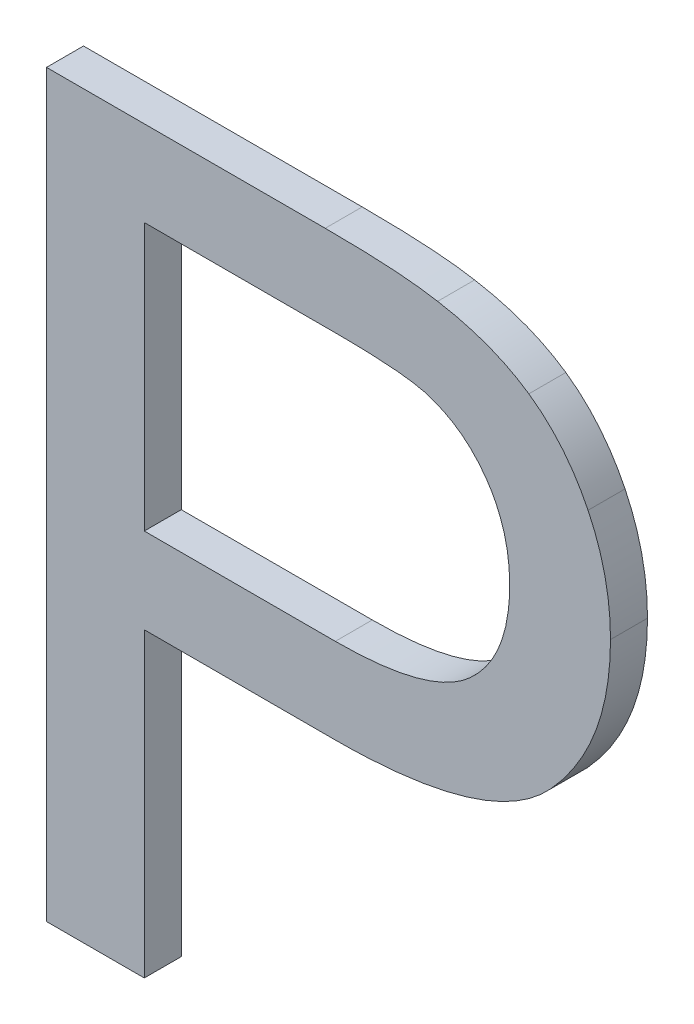
ISO-10303-21;
HEADER;
FILE_DESCRIPTION(('STEP AP214'),'2;1');
FILE_NAME('part.step','',(''),(''),'','','');
FILE_SCHEMA(('AUTOMOTIVE_DESIGN { 1 0 10303 214 1 1 1 1 }'));
ENDSEC;
DATA;
#1=APPLICATION_CONTEXT('core data for automotive mechanical design processes');
#2=APPLICATION_PROTOCOL_DEFINITION('international standard','automotive_design',2000,#1);
#3=PRODUCT_CONTEXT('',#1,'mechanical');
#4=PRODUCT('Part','Part','',(#3));
#5=PRODUCT_RELATED_PRODUCT_CATEGORY('part','',(#4));
#6=PRODUCT_DEFINITION_FORMATION('','',#4);
#7=PRODUCT_DEFINITION_CONTEXT('part definition',#1,'design');
#8=PRODUCT_DEFINITION('design','',#6,#7);
#9=PRODUCT_DEFINITION_SHAPE('','',#8);
#10=(LENGTH_UNIT() NAMED_UNIT(*) SI_UNIT(.MILLI.,.METRE.));
#11=(NAMED_UNIT(*) PLANE_ANGLE_UNIT() SI_UNIT($,.RADIAN.));
#12=(NAMED_UNIT(*) SI_UNIT($,.STERADIAN.) SOLID_ANGLE_UNIT());
#13=UNCERTAINTY_MEASURE_WITH_UNIT(LENGTH_MEASURE(1.E-05),#10,'distance_accuracy_value','');
#14=(GEOMETRIC_REPRESENTATION_CONTEXT(3) GLOBAL_UNCERTAINTY_ASSIGNED_CONTEXT((#13)) GLOBAL_UNIT_ASSIGNED_CONTEXT((#10,
#11,#12)) REPRESENTATION_CONTEXT('',''));
#15=CARTESIAN_POINT('',(0.,0.,0.));
#16=DIRECTION('',(0.,0.,1.));
#17=DIRECTION('',(1.,0.,0.));
#18=AXIS2_PLACEMENT_3D('',#15,#16,#17);
#19=CARTESIAN_POINT('',(2.1538376162,0.609544996919,0.05));
#20=DIRECTION('',(0.,0.,1.));
#21=DIRECTION('',(1.,0.,0.));
#22=AXIS2_PLACEMENT_3D('',#19,#20,#21);
#23=PLANE('',#22);
#24=DIRECTION('',(1.,0.,0.));
#25=VECTOR('',#24,1.);
#26=CARTESIAN_POINT('',(1.989916424419,0.523255813953,0.05));
#27=LINE('',#26,#25);
#28=CARTESIAN_POINT('',(1.989916424419,0.523255813953,0.05));
#29=VERTEX_POINT('',#28);
#30=CARTESIAN_POINT('',(2.248137718023,0.523255813953,0.05));
#31=VERTEX_POINT('',#30);
#32=EDGE_CURVE('E202',#29,#31,#27,.T.);
#33=ORIENTED_EDGE('',*,*,#32,.F.);
#34=DIRECTION('',(0.,-1.,0.));
#35=VECTOR('',#34,1.);
#36=CARTESIAN_POINT('',(1.989916424419,0.884447674419,0.05));
#37=LINE('',#36,#35);
#38=CARTESIAN_POINT('',(1.989916424419,0.884447674419,0.05));
#39=VERTEX_POINT('',#38);
#40=EDGE_CURVE('E383',#39,#29,#37,.T.);
#41=ORIENTED_EDGE('',*,*,#40,.F.);
#42=DIRECTION('',(-1.,0.,0.));
#43=VECTOR('',#42,1.);
#44=CARTESIAN_POINT('',(2.245412427326,0.884447674419,0.05));
#45=LINE('',#44,#43);
#46=CARTESIAN_POINT('',(2.245412427326,0.884447674419,0.05));
#47=VERTEX_POINT('',#46);
#48=EDGE_CURVE('E374',#47,#39,#45,.T.);
#49=ORIENTED_EDGE('',*,*,#48,.F.);
#50=CARTESIAN_POINT('',(2.368731831395,0.875499636628,0.05));
#51=CARTESIAN_POINT('',(2.335347020349,0.884447674419,0.05));
#52=CARTESIAN_POINT('',(2.245412427326,0.884447674419,0.05));
#53=(BOUNDED_CURVE() B_SPLINE_CURVE(2,(#50,#51,#52),.UNSPECIFIED.,.F.,
.F.) B_SPLINE_CURVE_WITH_KNOTS((3,3),(0.,1.),
.UNSPECIFIED.) CURVE() GEOMETRIC_REPRESENTATION_ITEM() RATIONAL_B_SPLINE_CURVE((1.,1.,1.)) REPRESENTATION_ITEM(''));
#54=CARTESIAN_POINT('',(2.368731831395,0.875499636628,0.05));
#55=VERTEX_POINT('',#54);
#56=EDGE_CURVE('E271',#55,#47,#53,.T.);
#57=ORIENTED_EDGE('',*,*,#56,.F.);
#58=CARTESIAN_POINT('',(2.452171148256,0.81586119186,0.05));
#59=CARTESIAN_POINT('',(2.420512354651,0.861010174419,0.05));
#60=CARTESIAN_POINT('',(2.368731831395,0.875499636628,0.05));
#61=(BOUNDED_CURVE() B_SPLINE_CURVE(2,(#58,#59,#60),.UNSPECIFIED.,.F.,
.F.) B_SPLINE_CURVE_WITH_KNOTS((3,3),(0.,1.),
.UNSPECIFIED.) CURVE() GEOMETRIC_REPRESENTATION_ITEM() RATIONAL_B_SPLINE_CURVE((1.,1.,1.)) REPRESENTATION_ITEM(''));
#62=CARTESIAN_POINT('',(2.452171148256,0.81586119186,0.05));
#63=VERTEX_POINT('',#62);
#64=EDGE_CURVE('E125',#63,#55,#61,.T.);
#65=ORIENTED_EDGE('',*,*,#64,.F.);
#66=CARTESIAN_POINT('',(2.483875363372,0.70730377907,0.05));
#67=CARTESIAN_POINT('',(2.483875363372,0.770712209302,0.05));
#68=CARTESIAN_POINT('',(2.452171148256,0.81586119186,0.05));
#69=(BOUNDED_CURVE() B_SPLINE_CURVE(2,(#66,#67,#68),.UNSPECIFIED.,.F.,
.F.) B_SPLINE_CURVE_WITH_KNOTS((3,3),(0.,1.),
.UNSPECIFIED.) CURVE() GEOMETRIC_REPRESENTATION_ITEM() RATIONAL_B_SPLINE_CURVE((1.,1.,1.)) REPRESENTATION_ITEM(''));
#70=CARTESIAN_POINT('',(2.483875363372,0.70730377907,0.05));
#71=VERTEX_POINT('',#70);
#72=EDGE_CURVE('E303',#71,#63,#69,.T.);
#73=ORIENTED_EDGE('',*,*,#72,.F.);
#74=CARTESIAN_POINT('',(2.430050872093,0.571493459302,0.05));
#75=CARTESIAN_POINT('',(2.483875363372,0.619776526163,0.05));
#76=CARTESIAN_POINT('',(2.483875363372,0.70730377907,0.05));
#77=(BOUNDED_CURVE() B_SPLINE_CURVE(2,(#74,#75,#76),.UNSPECIFIED.,.F.,
.F.) B_SPLINE_CURVE_WITH_KNOTS((3,3),(0.,1.),
.UNSPECIFIED.) CURVE() GEOMETRIC_REPRESENTATION_ITEM() RATIONAL_B_SPLINE_CURVE((1.,1.,1.)) REPRESENTATION_ITEM(''));
#78=CARTESIAN_POINT('',(2.430050872093,0.571493459302,0.05));
#79=VERTEX_POINT('',#78);
#80=EDGE_CURVE('E205',#79,#71,#77,.T.);
#81=ORIENTED_EDGE('',*,*,#80,.F.);
#82=CARTESIAN_POINT('',(2.248137718023,0.523255813953,0.05));
#83=CARTESIAN_POINT('',(2.376226380814,0.523255813953,0.05));
#84=CARTESIAN_POINT('',(2.430050872093,0.571493459302,0.05));
#85=(BOUNDED_CURVE() B_SPLINE_CURVE(2,(#82,#83,#84),.UNSPECIFIED.,.F.,
.F.) B_SPLINE_CURVE_WITH_KNOTS((3,3),(0.,1.),
.UNSPECIFIED.) CURVE() GEOMETRIC_REPRESENTATION_ITEM() RATIONAL_B_SPLINE_CURVE((1.,1.,1.)) REPRESENTATION_ITEM(''));
#86=EDGE_CURVE('E28',#31,#79,#85,.T.);
#87=ORIENTED_EDGE('',*,*,#86,.F.);
#88=EDGE_LOOP('',(#33,#41,#49,#57,#65,#73,#81,#87));
#89=FACE_BOUND('',#88,.T.);
#90=DIRECTION('',(0.,1.,0.));
#91=VECTOR('',#90,1.);
#92=CARTESIAN_POINT('',(1.857739825581,0.,0.05));
#93=LINE('',#92,#91);
#94=CARTESIAN_POINT('',(1.857739825581,0.,0.05));
#95=VERTEX_POINT('',#94);
#96=CARTESIAN_POINT('',(1.857739825581,1.,0.05));
#97=VERTEX_POINT('',#96);
#98=EDGE_CURVE('E287',#95,#97,#93,.T.);
#99=ORIENTED_EDGE('',*,*,#98,.F.);
#100=DIRECTION('',(-1.,0.,0.));
#101=VECTOR('',#100,1.);
#102=CARTESIAN_POINT('',(1.989916424419,0.,0.05));
#103=LINE('',#102,#101);
#104=CARTESIAN_POINT('',(1.989916424419,0.,0.05));
#105=VERTEX_POINT('',#104);
#106=EDGE_CURVE('E266',#105,#95,#103,.T.);
#107=ORIENTED_EDGE('',*,*,#106,.F.);
#108=DIRECTION('',(0.,-1.,0.));
#109=VECTOR('',#108,1.);
#110=CARTESIAN_POINT('',(1.989916424419,0.407703488372,0.05));
#111=LINE('',#110,#109);
#112=CARTESIAN_POINT('',(1.989916424419,0.407703488372,0.05));
#113=VERTEX_POINT('',#112);
#114=EDGE_CURVE('E254',#113,#105,#111,.T.);
#115=ORIENTED_EDGE('',*,*,#114,.F.);
#116=DIRECTION('',(-1.,0.,0.));
#117=VECTOR('',#116,1.);
#118=CARTESIAN_POINT('',(2.24609375,0.407703488372,0.05));
#119=LINE('',#118,#117);
#120=CARTESIAN_POINT('',(2.24609375,0.407703488372,0.05));
#121=VERTEX_POINT('',#120);
#122=EDGE_CURVE('E237',#121,#113,#119,.T.);
#123=ORIENTED_EDGE('',*,*,#122,.F.);
#124=CARTESIAN_POINT('',(2.5390625,0.495866642442,0.05));
#125=CARTESIAN_POINT('',(2.457985101744,0.407703488372,0.05));
#126=CARTESIAN_POINT('',(2.24609375,0.407703488372,0.05));
#127=(BOUNDED_CURVE() B_SPLINE_CURVE(2,(#124,#125,#126),.UNSPECIFIED.,.F.,
.F.) B_SPLINE_CURVE_WITH_KNOTS((3,3),(0.,1.),
.UNSPECIFIED.) CURVE() GEOMETRIC_REPRESENTATION_ITEM() RATIONAL_B_SPLINE_CURVE((1.,1.,1.)) REPRESENTATION_ITEM(''));
#128=CARTESIAN_POINT('',(2.5390625,0.495866642442,0.05));
#129=VERTEX_POINT('',#128);
#130=EDGE_CURVE('E379',#129,#121,#127,.T.);
#131=ORIENTED_EDGE('',*,*,#130,.F.);
#132=CARTESIAN_POINT('',(2.620139898256,0.711346293605,0.05));
#133=CARTESIAN_POINT('',(2.620139898256,0.584029796512,0.05));
#134=CARTESIAN_POINT('',(2.5390625,0.495866642442,0.05));
#135=(BOUNDED_CURVE() B_SPLINE_CURVE(2,(#132,#133,#134),.UNSPECIFIED.,.F.,
.F.) B_SPLINE_CURVE_WITH_KNOTS((3,3),(0.,1.),
.UNSPECIFIED.) CURVE() GEOMETRIC_REPRESENTATION_ITEM() RATIONAL_B_SPLINE_CURVE((1.,1.,1.)) REPRESENTATION_ITEM(''));
#136=CARTESIAN_POINT('',(2.620139898256,0.711346293605,0.05));
#137=VERTEX_POINT('',#136);
#138=EDGE_CURVE('E460',#137,#129,#135,.T.);
#139=ORIENTED_EDGE('',*,*,#138,.F.);
#140=CARTESIAN_POINT('',(2.589798328488,0.847519985465,0.05));
#141=CARTESIAN_POINT('',(2.620139898256,0.785565043605,0.05));
#142=CARTESIAN_POINT('',(2.620139898256,0.711346293605,0.05));
#143=(BOUNDED_CURVE() B_SPLINE_CURVE(2,(#140,#141,#142),.UNSPECIFIED.,.F.,
.F.) B_SPLINE_CURVE_WITH_KNOTS((3,3),(0.,1.),
.UNSPECIFIED.) CURVE() GEOMETRIC_REPRESENTATION_ITEM() RATIONAL_B_SPLINE_CURVE((1.,1.,1.)) REPRESENTATION_ITEM(''));
#144=CARTESIAN_POINT('',(2.589798328488,0.847519985465,0.05));
#145=VERTEX_POINT('',#144);
#146=EDGE_CURVE('E345',#145,#137,#143,.T.);
#147=ORIENTED_EDGE('',*,*,#146,.F.);
#148=CARTESIAN_POINT('',(2.509765625,0.943813590116,0.05));
#149=CARTESIAN_POINT('',(2.559502180233,0.909474927326,0.05));
#150=CARTESIAN_POINT('',(2.589798328488,0.847519985465,0.05));
#151=(BOUNDED_CURVE() B_SPLINE_CURVE(2,(#148,#149,#150),.UNSPECIFIED.,.F.,
.F.) B_SPLINE_CURVE_WITH_KNOTS((3,3),(0.,1.),
.UNSPECIFIED.) CURVE() GEOMETRIC_REPRESENTATION_ITEM() RATIONAL_B_SPLINE_CURVE((1.,1.,1.)) REPRESENTATION_ITEM(''));
#152=CARTESIAN_POINT('',(2.509765625,0.943813590116,0.05));
#153=VERTEX_POINT('',#152);
#154=EDGE_CURVE('E292',#153,#145,#151,.T.);
#155=ORIENTED_EDGE('',*,*,#154,.F.);
#156=CARTESIAN_POINT('',(2.38644622093,0.990461482558,0.05));
#157=CARTESIAN_POINT('',(2.460029069767,0.978197674419,0.05));
#158=CARTESIAN_POINT('',(2.509765625,0.943813590116,0.05));
#159=(BOUNDED_CURVE() B_SPLINE_CURVE(2,(#156,#157,#158),.UNSPECIFIED.,.F.,
.F.) B_SPLINE_CURVE_WITH_KNOTS((3,3),(0.,1.),
.UNSPECIFIED.) CURVE() GEOMETRIC_REPRESENTATION_ITEM() RATIONAL_B_SPLINE_CURVE((1.,1.,1.)) REPRESENTATION_ITEM(''));
#160=CARTESIAN_POINT('',(2.38644622093,0.990461482558,0.05));
#161=VERTEX_POINT('',#160);
#162=EDGE_CURVE('E244',#161,#153,#159,.T.);
#163=ORIENTED_EDGE('',*,*,#162,.F.);
#164=CARTESIAN_POINT('',(2.234511264535,1.,0.05));
#165=CARTESIAN_POINT('',(2.333984375,1.,0.05));
#166=CARTESIAN_POINT('',(2.38644622093,0.990461482558,0.05));
#167=(BOUNDED_CURVE() B_SPLINE_CURVE(2,(#164,#165,#166),.UNSPECIFIED.,.F.,
.F.) B_SPLINE_CURVE_WITH_KNOTS((3,3),(0.,1.),
.UNSPECIFIED.) CURVE() GEOMETRIC_REPRESENTATION_ITEM() RATIONAL_B_SPLINE_CURVE((1.,1.,1.)) REPRESENTATION_ITEM(''));
#168=CARTESIAN_POINT('',(2.234511264535,1.,0.05));
#169=VERTEX_POINT('',#168);
#170=EDGE_CURVE('E317',#169,#161,#167,.T.);
#171=ORIENTED_EDGE('',*,*,#170,.F.);
#172=DIRECTION('',(1.,0.,0.));
#173=VECTOR('',#172,1.);
#174=CARTESIAN_POINT('',(1.857739825581,1.,0.05));
#175=LINE('',#174,#173);
#176=EDGE_CURVE('E265',#97,#169,#175,.T.);
#177=ORIENTED_EDGE('',*,*,#176,.F.);
#178=EDGE_LOOP('',(#99,#107,#115,#123,#131,#139,#147,#155,#163,#171,#177));
#179=FACE_BOUND('',#178,.T.);
#180=ADVANCED_FACE('F17',(#89,#179),#23,.T.);
#181=CARTESIAN_POINT('',(2.1538376162,0.609544996919,0.));
#182=DIRECTION('',(0.,0.,1.));
#183=DIRECTION('',(1.,0.,0.));
#184=AXIS2_PLACEMENT_3D('',#181,#182,#183);
#185=PLANE('',#184);
#186=CARTESIAN_POINT('',(2.248137718023,0.523255813953,0.));
#187=CARTESIAN_POINT('',(2.376226380814,0.523255813953,0.));
#188=CARTESIAN_POINT('',(2.430050872093,0.571493459302,0.));
#189=(BOUNDED_CURVE() B_SPLINE_CURVE(2,(#186,#187,#188),.UNSPECIFIED.,.F.,
.F.) B_SPLINE_CURVE_WITH_KNOTS((3,3),(0.,1.),
.UNSPECIFIED.) CURVE() GEOMETRIC_REPRESENTATION_ITEM() RATIONAL_B_SPLINE_CURVE((1.,1.,1.)) REPRESENTATION_ITEM(''));
#190=CARTESIAN_POINT('',(2.248137718023,0.523255813953,0.));
#191=VERTEX_POINT('',#190);
#192=CARTESIAN_POINT('',(2.430050872093,0.571493459302,0.));
#193=VERTEX_POINT('',#192);
#194=EDGE_CURVE('E11',#191,#193,#189,.T.);
#195=ORIENTED_EDGE('',*,*,#194,.T.);
#196=CARTESIAN_POINT('',(2.430050872093,0.571493459302,0.));
#197=CARTESIAN_POINT('',(2.483875363372,0.619776526163,0.));
#198=CARTESIAN_POINT('',(2.483875363372,0.70730377907,0.));
#199=(BOUNDED_CURVE() B_SPLINE_CURVE(2,(#196,#197,#198),.UNSPECIFIED.,.F.,
.F.) B_SPLINE_CURVE_WITH_KNOTS((3,3),(0.,1.),
.UNSPECIFIED.) CURVE() GEOMETRIC_REPRESENTATION_ITEM() RATIONAL_B_SPLINE_CURVE((1.,1.,1.)) REPRESENTATION_ITEM(''));
#200=CARTESIAN_POINT('',(2.483875363372,0.70730377907,0.));
#201=VERTEX_POINT('',#200);
#202=EDGE_CURVE('E208',#193,#201,#199,.T.);
#203=ORIENTED_EDGE('',*,*,#202,.T.);
#204=CARTESIAN_POINT('',(2.483875363372,0.70730377907,0.));
#205=CARTESIAN_POINT('',(2.483875363372,0.770712209302,0.));
#206=CARTESIAN_POINT('',(2.452171148256,0.81586119186,0.));
#207=(BOUNDED_CURVE() B_SPLINE_CURVE(2,(#204,#205,#206),.UNSPECIFIED.,.F.,
.F.) B_SPLINE_CURVE_WITH_KNOTS((3,3),(0.,1.),
.UNSPECIFIED.) CURVE() GEOMETRIC_REPRESENTATION_ITEM() RATIONAL_B_SPLINE_CURVE((1.,1.,1.)) REPRESENTATION_ITEM(''));
#208=CARTESIAN_POINT('',(2.452171148256,0.81586119186,0.));
#209=VERTEX_POINT('',#208);
#210=EDGE_CURVE('E110',#201,#209,#207,.T.);
#211=ORIENTED_EDGE('',*,*,#210,.T.);
#212=CARTESIAN_POINT('',(2.452171148256,0.81586119186,0.));
#213=CARTESIAN_POINT('',(2.420512354651,0.861010174419,0.));
#214=CARTESIAN_POINT('',(2.368731831395,0.875499636628,0.));
#215=(BOUNDED_CURVE() B_SPLINE_CURVE(2,(#212,#213,#214),.UNSPECIFIED.,.F.,
.F.) B_SPLINE_CURVE_WITH_KNOTS((3,3),(0.,1.),
.UNSPECIFIED.) CURVE() GEOMETRIC_REPRESENTATION_ITEM() RATIONAL_B_SPLINE_CURVE((1.,1.,1.)) REPRESENTATION_ITEM(''));
#216=CARTESIAN_POINT('',(2.368731831395,0.875499636628,0.));
#217=VERTEX_POINT('',#216);
#218=EDGE_CURVE('E238',#209,#217,#215,.T.);
#219=ORIENTED_EDGE('',*,*,#218,.T.);
#220=CARTESIAN_POINT('',(2.368731831395,0.875499636628,0.));
#221=CARTESIAN_POINT('',(2.335347020349,0.884447674419,0.));
#222=CARTESIAN_POINT('',(2.245412427326,0.884447674419,0.));
#223=(BOUNDED_CURVE() B_SPLINE_CURVE(2,(#220,#221,#222),.UNSPECIFIED.,.F.,
.F.) B_SPLINE_CURVE_WITH_KNOTS((3,3),(0.,1.),
.UNSPECIFIED.) CURVE() GEOMETRIC_REPRESENTATION_ITEM() RATIONAL_B_SPLINE_CURVE((1.,1.,1.)) REPRESENTATION_ITEM(''));
#224=CARTESIAN_POINT('',(2.245412427326,0.884447674419,0.));
#225=VERTEX_POINT('',#224);
#226=EDGE_CURVE('E277',#217,#225,#223,.T.);
#227=ORIENTED_EDGE('',*,*,#226,.T.);
#228=DIRECTION('',(-1.,0.,0.));
#229=VECTOR('',#228,1.);
#230=CARTESIAN_POINT('',(2.245412427326,0.884447674419,0.));
#231=LINE('',#230,#229);
#232=CARTESIAN_POINT('',(1.989916424419,0.884447674419,0.));
#233=VERTEX_POINT('',#232);
#234=EDGE_CURVE('E431',#225,#233,#231,.T.);
#235=ORIENTED_EDGE('',*,*,#234,.T.);
#236=DIRECTION('',(0.,-1.,0.));
#237=VECTOR('',#236,1.);
#238=CARTESIAN_POINT('',(1.989916424419,0.884447674419,0.));
#239=LINE('',#238,#237);
#240=CARTESIAN_POINT('',(1.989916424419,0.523255813953,0.));
#241=VERTEX_POINT('',#240);
#242=EDGE_CURVE('E375',#233,#241,#239,.T.);
#243=ORIENTED_EDGE('',*,*,#242,.T.);
#244=DIRECTION('',(1.,0.,0.));
#245=VECTOR('',#244,1.);
#246=CARTESIAN_POINT('',(1.989916424419,0.523255813953,0.));
#247=LINE('',#246,#245);
#248=EDGE_CURVE('E215',#241,#191,#247,.T.);
#249=ORIENTED_EDGE('',*,*,#248,.T.);
#250=EDGE_LOOP('',(#195,#203,#211,#219,#227,#235,#243,#249));
#251=FACE_BOUND('',#250,.T.);
#252=DIRECTION('',(1.,0.,0.));
#253=VECTOR('',#252,1.);
#254=CARTESIAN_POINT('',(1.857739825581,1.,0.));
#255=LINE('',#254,#253);
#256=CARTESIAN_POINT('',(1.857739825581,1.,0.));
#257=VERTEX_POINT('',#256);
#258=CARTESIAN_POINT('',(2.234511264535,1.,0.));
#259=VERTEX_POINT('',#258);
#260=EDGE_CURVE('E226',#257,#259,#255,.T.);
#261=ORIENTED_EDGE('',*,*,#260,.T.);
#262=CARTESIAN_POINT('',(2.234511264535,1.,0.));
#263=CARTESIAN_POINT('',(2.333984375,1.,0.));
#264=CARTESIAN_POINT('',(2.38644622093,0.990461482558,0.));
#265=(BOUNDED_CURVE() B_SPLINE_CURVE(2,(#262,#263,#264),.UNSPECIFIED.,.F.,
.F.) B_SPLINE_CURVE_WITH_KNOTS((3,3),(0.,1.),
.UNSPECIFIED.) CURVE() GEOMETRIC_REPRESENTATION_ITEM() RATIONAL_B_SPLINE_CURVE((1.,1.,1.)) REPRESENTATION_ITEM(''));
#266=CARTESIAN_POINT('',(2.38644622093,0.990461482558,0.));
#267=VERTEX_POINT('',#266);
#268=EDGE_CURVE('E322',#259,#267,#265,.T.);
#269=ORIENTED_EDGE('',*,*,#268,.T.);
#270=CARTESIAN_POINT('',(2.38644622093,0.990461482558,0.));
#271=CARTESIAN_POINT('',(2.460029069767,0.978197674419,0.));
#272=CARTESIAN_POINT('',(2.509765625,0.943813590116,0.));
#273=(BOUNDED_CURVE() B_SPLINE_CURVE(2,(#270,#271,#272),.UNSPECIFIED.,.F.,
.F.) B_SPLINE_CURVE_WITH_KNOTS((3,3),(0.,1.),
.UNSPECIFIED.) CURVE() GEOMETRIC_REPRESENTATION_ITEM() RATIONAL_B_SPLINE_CURVE((1.,1.,1.)) REPRESENTATION_ITEM(''));
#274=CARTESIAN_POINT('',(2.509765625,0.943813590116,0.));
#275=VERTEX_POINT('',#274);
#276=EDGE_CURVE('E252',#267,#275,#273,.T.);
#277=ORIENTED_EDGE('',*,*,#276,.T.);
#278=CARTESIAN_POINT('',(2.509765625,0.943813590116,0.));
#279=CARTESIAN_POINT('',(2.559502180233,0.909474927326,0.));
#280=CARTESIAN_POINT('',(2.589798328488,0.847519985465,0.));
#281=(BOUNDED_CURVE() B_SPLINE_CURVE(2,(#278,#279,#280),.UNSPECIFIED.,.F.,
.F.) B_SPLINE_CURVE_WITH_KNOTS((3,3),(0.,1.),
.UNSPECIFIED.) CURVE() GEOMETRIC_REPRESENTATION_ITEM() RATIONAL_B_SPLINE_CURVE((1.,1.,1.)) REPRESENTATION_ITEM(''));
#282=CARTESIAN_POINT('',(2.589798328488,0.847519985465,0.));
#283=VERTEX_POINT('',#282);
#284=EDGE_CURVE('E344',#275,#283,#281,.T.);
#285=ORIENTED_EDGE('',*,*,#284,.T.);
#286=CARTESIAN_POINT('',(2.589798328488,0.847519985465,0.));
#287=CARTESIAN_POINT('',(2.620139898256,0.785565043605,0.));
#288=CARTESIAN_POINT('',(2.620139898256,0.711346293605,0.));
#289=(BOUNDED_CURVE() B_SPLINE_CURVE(2,(#286,#287,#288),.UNSPECIFIED.,.F.,
.F.) B_SPLINE_CURVE_WITH_KNOTS((3,3),(0.,1.),
.UNSPECIFIED.) CURVE() GEOMETRIC_REPRESENTATION_ITEM() RATIONAL_B_SPLINE_CURVE((1.,1.,1.)) REPRESENTATION_ITEM(''));
#290=CARTESIAN_POINT('',(2.620139898256,0.711346293605,0.));
#291=VERTEX_POINT('',#290);
#292=EDGE_CURVE('E293',#283,#291,#289,.T.);
#293=ORIENTED_EDGE('',*,*,#292,.T.);
#294=CARTESIAN_POINT('',(2.620139898256,0.711346293605,0.));
#295=CARTESIAN_POINT('',(2.620139898256,0.584029796512,0.));
#296=CARTESIAN_POINT('',(2.5390625,0.495866642442,0.));
#297=(BOUNDED_CURVE() B_SPLINE_CURVE(2,(#294,#295,#296),.UNSPECIFIED.,.F.,
.F.) B_SPLINE_CURVE_WITH_KNOTS((3,3),(0.,1.),
.UNSPECIFIED.) CURVE() GEOMETRIC_REPRESENTATION_ITEM() RATIONAL_B_SPLINE_CURVE((1.,1.,1.)) REPRESENTATION_ITEM(''));
#298=CARTESIAN_POINT('',(2.5390625,0.495866642442,0.));
#299=VERTEX_POINT('',#298);
#300=EDGE_CURVE('E230',#291,#299,#297,.T.);
#301=ORIENTED_EDGE('',*,*,#300,.T.);
#302=CARTESIAN_POINT('',(2.5390625,0.495866642442,0.));
#303=CARTESIAN_POINT('',(2.457985101744,0.407703488372,0.));
#304=CARTESIAN_POINT('',(2.24609375,0.407703488372,0.));
#305=(BOUNDED_CURVE() B_SPLINE_CURVE(2,(#302,#303,#304),.UNSPECIFIED.,.F.,
.F.) B_SPLINE_CURVE_WITH_KNOTS((3,3),(0.,1.),
.UNSPECIFIED.) CURVE() GEOMETRIC_REPRESENTATION_ITEM() RATIONAL_B_SPLINE_CURVE((1.,1.,1.)) REPRESENTATION_ITEM(''));
#306=CARTESIAN_POINT('',(2.24609375,0.407703488372,0.));
#307=VERTEX_POINT('',#306);
#308=EDGE_CURVE('E448',#299,#307,#305,.T.);
#309=ORIENTED_EDGE('',*,*,#308,.T.);
#310=DIRECTION('',(-1.,0.,0.));
#311=VECTOR('',#310,1.);
#312=CARTESIAN_POINT('',(2.24609375,0.407703488372,0.));
#313=LINE('',#312,#311);
#314=CARTESIAN_POINT('',(1.989916424419,0.407703488372,0.));
#315=VERTEX_POINT('',#314);
#316=EDGE_CURVE('E234',#307,#315,#313,.T.);
#317=ORIENTED_EDGE('',*,*,#316,.T.);
#318=DIRECTION('',(0.,-1.,0.));
#319=VECTOR('',#318,1.);
#320=CARTESIAN_POINT('',(1.989916424419,0.407703488372,0.));
#321=LINE('',#320,#319);
#322=CARTESIAN_POINT('',(1.989916424419,0.,0.));
#323=VERTEX_POINT('',#322);
#324=EDGE_CURVE('E260',#315,#323,#321,.T.);
#325=ORIENTED_EDGE('',*,*,#324,.T.);
#326=DIRECTION('',(-1.,0.,0.));
#327=VECTOR('',#326,1.);
#328=CARTESIAN_POINT('',(1.989916424419,0.,0.));
#329=LINE('',#328,#327);
#330=CARTESIAN_POINT('',(1.857739825581,0.,0.));
#331=VERTEX_POINT('',#330);
#332=EDGE_CURVE('E269',#323,#331,#329,.T.);
#333=ORIENTED_EDGE('',*,*,#332,.T.);
#334=DIRECTION('',(0.,1.,0.));
#335=VECTOR('',#334,1.);
#336=CARTESIAN_POINT('',(1.857739825581,0.,0.));
#337=LINE('',#336,#335);
#338=EDGE_CURVE('E286',#331,#257,#337,.T.);
#339=ORIENTED_EDGE('',*,*,#338,.T.);
#340=EDGE_LOOP('',(#261,#269,#277,#285,#293,#301,#309,#317,#325,#333,#339));
#341=FACE_BOUND('',#340,.T.);
#342=ADVANCED_FACE('F512',(#251,#341),#185,.F.);
#343=CARTESIAN_POINT('',(2.248137718023,0.523255813953,0.));
#344=CARTESIAN_POINT('',(2.376226380814,0.523255813953,0.));
#345=CARTESIAN_POINT('',(2.430050872093,0.571493459302,0.));
#346=(BOUNDED_CURVE() B_SPLINE_CURVE(2,(#343,#344,#345),.UNSPECIFIED.,.F.,
.F.) B_SPLINE_CURVE_WITH_KNOTS((3,3),(0.,1.),
.UNSPECIFIED.) CURVE() GEOMETRIC_REPRESENTATION_ITEM() RATIONAL_B_SPLINE_CURVE((1.,1.,1.)) REPRESENTATION_ITEM(''));
#347=DIRECTION('',(0.,0.,-1.));
#348=VECTOR('',#347,1.);
#349=SURFACE_OF_LINEAR_EXTRUSION('',#346,#348);
#350=DIRECTION('',(0.,0.,1.));
#351=VECTOR('',#350,1.);
#352=CARTESIAN_POINT('',(2.248137718023,0.523255813953,0.));
#353=LINE('',#352,#351);
#354=EDGE_CURVE('E211',#191,#31,#353,.T.);
#355=ORIENTED_EDGE('',*,*,#354,.T.);
#356=ORIENTED_EDGE('',*,*,#86,.T.);
#357=DIRECTION('',(0.,0.,1.));
#358=VECTOR('',#357,1.);
#359=CARTESIAN_POINT('',(2.430050872093,0.571493459302,0.));
#360=LINE('',#359,#358);
#361=EDGE_CURVE('E328',#193,#79,#360,.T.);
#362=ORIENTED_EDGE('',*,*,#361,.F.);
#363=ORIENTED_EDGE('',*,*,#194,.F.);
#364=EDGE_LOOP('',(#355,#356,#362,#363));
#365=FACE_BOUND('',#364,.T.);
#366=ADVANCED_FACE('F19',(#365),#349,.T.);
#367=CARTESIAN_POINT('',(2.430050872093,0.571493459302,0.));
#368=CARTESIAN_POINT('',(2.483875363372,0.619776526163,0.));
#369=CARTESIAN_POINT('',(2.483875363372,0.70730377907,0.));
#370=(BOUNDED_CURVE() B_SPLINE_CURVE(2,(#367,#368,#369),.UNSPECIFIED.,.F.,
.F.) B_SPLINE_CURVE_WITH_KNOTS((3,3),(0.,1.),
.UNSPECIFIED.) CURVE() GEOMETRIC_REPRESENTATION_ITEM() RATIONAL_B_SPLINE_CURVE((1.,1.,1.)) REPRESENTATION_ITEM(''));
#371=DIRECTION('',(0.,0.,-1.));
#372=VECTOR('',#371,1.);
#373=SURFACE_OF_LINEAR_EXTRUSION('',#370,#372);
#374=ORIENTED_EDGE('',*,*,#361,.T.);
#375=ORIENTED_EDGE('',*,*,#80,.T.);
#376=DIRECTION('',(0.,0.,1.));
#377=VECTOR('',#376,1.);
#378=CARTESIAN_POINT('',(2.483875363372,0.70730377907,0.));
#379=LINE('',#378,#377);
#380=EDGE_CURVE('E243',#201,#71,#379,.T.);
#381=ORIENTED_EDGE('',*,*,#380,.F.);
#382=ORIENTED_EDGE('',*,*,#202,.F.);
#383=EDGE_LOOP('',(#374,#375,#381,#382));
#384=FACE_BOUND('',#383,.T.);
#385=ADVANCED_FACE('F576',(#384),#373,.T.);
#386=CARTESIAN_POINT('',(2.483875363372,0.70730377907,0.));
#387=CARTESIAN_POINT('',(2.483875363372,0.770712209302,0.));
#388=CARTESIAN_POINT('',(2.452171148256,0.81586119186,0.));
#389=(BOUNDED_CURVE() B_SPLINE_CURVE(2,(#386,#387,#388),.UNSPECIFIED.,.F.,
.F.) B_SPLINE_CURVE_WITH_KNOTS((3,3),(0.,1.),
.UNSPECIFIED.) CURVE() GEOMETRIC_REPRESENTATION_ITEM() RATIONAL_B_SPLINE_CURVE((1.,1.,1.)) REPRESENTATION_ITEM(''));
#390=DIRECTION('',(0.,0.,-1.));
#391=VECTOR('',#390,1.);
#392=SURFACE_OF_LINEAR_EXTRUSION('',#389,#391);
#393=ORIENTED_EDGE('',*,*,#380,.T.);
#394=ORIENTED_EDGE('',*,*,#72,.T.);
#395=DIRECTION('',(0.,0.,1.));
#396=VECTOR('',#395,1.);
#397=CARTESIAN_POINT('',(2.452171148256,0.81586119186,0.));
#398=LINE('',#397,#396);
#399=EDGE_CURVE('E311',#209,#63,#398,.T.);
#400=ORIENTED_EDGE('',*,*,#399,.F.);
#401=ORIENTED_EDGE('',*,*,#210,.F.);
#402=EDGE_LOOP('',(#393,#394,#400,#401));
#403=FACE_BOUND('',#402,.T.);
#404=ADVANCED_FACE('F582',(#403),#392,.T.);
#405=CARTESIAN_POINT('',(2.452171148256,0.81586119186,0.));
#406=CARTESIAN_POINT('',(2.420512354651,0.861010174419,0.));
#407=CARTESIAN_POINT('',(2.368731831395,0.875499636628,0.));
#408=(BOUNDED_CURVE() B_SPLINE_CURVE(2,(#405,#406,#407),.UNSPECIFIED.,.F.,
.F.) B_SPLINE_CURVE_WITH_KNOTS((3,3),(0.,1.),
.UNSPECIFIED.) CURVE() GEOMETRIC_REPRESENTATION_ITEM() RATIONAL_B_SPLINE_CURVE((1.,1.,1.)) REPRESENTATION_ITEM(''));
#409=DIRECTION('',(0.,0.,-1.));
#410=VECTOR('',#409,1.);
#411=SURFACE_OF_LINEAR_EXTRUSION('',#408,#410);
#412=ORIENTED_EDGE('',*,*,#399,.T.);
#413=ORIENTED_EDGE('',*,*,#64,.T.);
#414=DIRECTION('',(0.,0.,1.));
#415=VECTOR('',#414,1.);
#416=CARTESIAN_POINT('',(2.368731831395,0.875499636628,0.));
#417=LINE('',#416,#415);
#418=EDGE_CURVE('E278',#217,#55,#417,.T.);
#419=ORIENTED_EDGE('',*,*,#418,.F.);
#420=ORIENTED_EDGE('',*,*,#218,.F.);
#421=EDGE_LOOP('',(#412,#413,#419,#420));
#422=FACE_BOUND('',#421,.T.);
#423=ADVANCED_FACE('F578',(#422),#411,.T.);
#424=CARTESIAN_POINT('',(2.368731831395,0.875499636628,0.));
#425=CARTESIAN_POINT('',(2.335347020349,0.884447674419,0.));
#426=CARTESIAN_POINT('',(2.245412427326,0.884447674419,0.));
#427=(BOUNDED_CURVE() B_SPLINE_CURVE(2,(#424,#425,#426),.UNSPECIFIED.,.F.,
.F.) B_SPLINE_CURVE_WITH_KNOTS((3,3),(0.,1.),
.UNSPECIFIED.) CURVE() GEOMETRIC_REPRESENTATION_ITEM() RATIONAL_B_SPLINE_CURVE((1.,1.,1.)) REPRESENTATION_ITEM(''));
#428=DIRECTION('',(0.,0.,-1.));
#429=VECTOR('',#428,1.);
#430=SURFACE_OF_LINEAR_EXTRUSION('',#427,#429);
#431=ORIENTED_EDGE('',*,*,#418,.T.);
#432=ORIENTED_EDGE('',*,*,#56,.T.);
#433=DIRECTION('',(0.,0.,1.));
#434=VECTOR('',#433,1.);
#435=CARTESIAN_POINT('',(2.245412427326,0.884447674419,0.));
#436=LINE('',#435,#434);
#437=EDGE_CURVE('E367',#225,#47,#436,.T.);
#438=ORIENTED_EDGE('',*,*,#437,.F.);
#439=ORIENTED_EDGE('',*,*,#226,.F.);
#440=EDGE_LOOP('',(#431,#432,#438,#439));
#441=FACE_BOUND('',#440,.T.);
#442=ADVANCED_FACE('F581',(#441),#430,.T.);
#443=CARTESIAN_POINT('',(2.245412427326,0.884447674419,0.));
#444=DIRECTION('',(0.,-1.,0.));
#445=DIRECTION('',(0.,0.,-1.));
#446=AXIS2_PLACEMENT_3D('',#443,#444,#445);
#447=PLANE('',#446);
#448=ORIENTED_EDGE('',*,*,#437,.T.);
#449=ORIENTED_EDGE('',*,*,#48,.T.);
#450=DIRECTION('',(0.,0.,1.));
#451=VECTOR('',#450,1.);
#452=CARTESIAN_POINT('',(1.989916424419,0.884447674419,0.));
#453=LINE('',#452,#451);
#454=EDGE_CURVE('E355',#233,#39,#453,.T.);
#455=ORIENTED_EDGE('',*,*,#454,.F.);
#456=ORIENTED_EDGE('',*,*,#234,.F.);
#457=EDGE_LOOP('',(#448,#449,#455,#456));
#458=FACE_BOUND('',#457,.T.);
#459=ADVANCED_FACE('F610',(#458),#447,.T.);
#460=CARTESIAN_POINT('',(1.989916424419,0.884447674419,0.));
#461=DIRECTION('',(1.,0.,0.));
#462=DIRECTION('',(0.,1.,0.));
#463=AXIS2_PLACEMENT_3D('',#460,#461,#462);
#464=PLANE('',#463);
#465=ORIENTED_EDGE('',*,*,#454,.T.);
#466=ORIENTED_EDGE('',*,*,#40,.T.);
#467=DIRECTION('',(0.,0.,1.));
#468=VECTOR('',#467,1.);
#469=CARTESIAN_POINT('',(1.989916424419,0.523255813953,0.));
#470=LINE('',#469,#468);
#471=EDGE_CURVE('E219',#241,#29,#470,.T.);
#472=ORIENTED_EDGE('',*,*,#471,.F.);
#473=ORIENTED_EDGE('',*,*,#242,.F.);
#474=EDGE_LOOP('',(#465,#466,#472,#473));
#475=FACE_BOUND('',#474,.T.);
#476=ADVANCED_FACE('F602',(#475),#464,.T.);
#477=CARTESIAN_POINT('',(1.989916424419,0.523255813953,0.));
#478=DIRECTION('',(0.,1.,0.));
#479=DIRECTION('',(1.,0.,0.));
#480=AXIS2_PLACEMENT_3D('',#477,#478,#479);
#481=PLANE('',#480);
#482=ORIENTED_EDGE('',*,*,#471,.T.);
#483=ORIENTED_EDGE('',*,*,#32,.T.);
#484=ORIENTED_EDGE('',*,*,#354,.F.);
#485=ORIENTED_EDGE('',*,*,#248,.F.);
#486=EDGE_LOOP('',(#482,#483,#484,#485));
#487=FACE_BOUND('',#486,.T.);
#488=ADVANCED_FACE('F217',(#487),#481,.T.);
#489=CARTESIAN_POINT('',(1.857739825581,1.,0.));
#490=DIRECTION('',(0.,1.,0.));
#491=DIRECTION('',(1.,0.,0.));
#492=AXIS2_PLACEMENT_3D('',#489,#490,#491);
#493=PLANE('',#492);
#494=DIRECTION('',(0.,0.,1.));
#495=VECTOR('',#494,1.);
#496=CARTESIAN_POINT('',(1.857739825581,1.,0.));
#497=LINE('',#496,#495);
#498=EDGE_CURVE('E279',#257,#97,#497,.T.);
#499=ORIENTED_EDGE('',*,*,#498,.T.);
#500=ORIENTED_EDGE('',*,*,#176,.T.);
#501=DIRECTION('',(0.,0.,1.));
#502=VECTOR('',#501,1.);
#503=CARTESIAN_POINT('',(2.234511264535,1.,0.));
#504=LINE('',#503,#502);
#505=EDGE_CURVE('E302',#259,#169,#504,.T.);
#506=ORIENTED_EDGE('',*,*,#505,.F.);
#507=ORIENTED_EDGE('',*,*,#260,.F.);
#508=EDGE_LOOP('',(#499,#500,#506,#507));
#509=FACE_BOUND('',#508,.T.);
#510=ADVANCED_FACE('F528',(#509),#493,.T.);
#511=CARTESIAN_POINT('',(2.234511264535,1.,0.));
#512=CARTESIAN_POINT('',(2.333984375,1.,0.));
#513=CARTESIAN_POINT('',(2.38644622093,0.990461482558,0.));
#514=(BOUNDED_CURVE() B_SPLINE_CURVE(2,(#511,#512,#513),.UNSPECIFIED.,.F.,
.F.) B_SPLINE_CURVE_WITH_KNOTS((3,3),(0.,1.),
.UNSPECIFIED.) CURVE() GEOMETRIC_REPRESENTATION_ITEM() RATIONAL_B_SPLINE_CURVE((1.,1.,1.)) REPRESENTATION_ITEM(''));
#515=DIRECTION('',(0.,0.,-1.));
#516=VECTOR('',#515,1.);
#517=SURFACE_OF_LINEAR_EXTRUSION('',#514,#516);
#518=ORIENTED_EDGE('',*,*,#505,.T.);
#519=ORIENTED_EDGE('',*,*,#170,.T.);
#520=DIRECTION('',(0.,0.,1.));
#521=VECTOR('',#520,1.);
#522=CARTESIAN_POINT('',(2.38644622093,0.990461482558,0.));
#523=LINE('',#522,#521);
#524=EDGE_CURVE('E253',#267,#161,#523,.T.);
#525=ORIENTED_EDGE('',*,*,#524,.F.);
#526=ORIENTED_EDGE('',*,*,#268,.F.);
#527=EDGE_LOOP('',(#518,#519,#525,#526));
#528=FACE_BOUND('',#527,.T.);
#529=ADVANCED_FACE('F527',(#528),#517,.T.);
#530=CARTESIAN_POINT('',(2.38644622093,0.990461482558,0.));
#531=CARTESIAN_POINT('',(2.460029069767,0.978197674419,0.));
#532=CARTESIAN_POINT('',(2.509765625,0.943813590116,0.));
#533=(BOUNDED_CURVE() B_SPLINE_CURVE(2,(#530,#531,#532),.UNSPECIFIED.,.F.,
.F.) B_SPLINE_CURVE_WITH_KNOTS((3,3),(0.,1.),
.UNSPECIFIED.) CURVE() GEOMETRIC_REPRESENTATION_ITEM() RATIONAL_B_SPLINE_CURVE((1.,1.,1.)) REPRESENTATION_ITEM(''));
#534=DIRECTION('',(0.,0.,-1.));
#535=VECTOR('',#534,1.);
#536=SURFACE_OF_LINEAR_EXTRUSION('',#533,#535);
#537=ORIENTED_EDGE('',*,*,#524,.T.);
#538=ORIENTED_EDGE('',*,*,#162,.T.);
#539=DIRECTION('',(0.,0.,1.));
#540=VECTOR('',#539,1.);
#541=CARTESIAN_POINT('',(2.509765625,0.943813590116,0.));
#542=LINE('',#541,#540);
#543=EDGE_CURVE('E288',#275,#153,#542,.T.);
#544=ORIENTED_EDGE('',*,*,#543,.F.);
#545=ORIENTED_EDGE('',*,*,#276,.F.);
#546=EDGE_LOOP('',(#537,#538,#544,#545));
#547=FACE_BOUND('',#546,.T.);
#548=ADVANCED_FACE('F535',(#547),#536,.T.);
#549=CARTESIAN_POINT('',(2.509765625,0.943813590116,0.));
#550=CARTESIAN_POINT('',(2.559502180233,0.909474927326,0.));
#551=CARTESIAN_POINT('',(2.589798328488,0.847519985465,0.));
#552=(BOUNDED_CURVE() B_SPLINE_CURVE(2,(#549,#550,#551),.UNSPECIFIED.,.F.,
.F.) B_SPLINE_CURVE_WITH_KNOTS((3,3),(0.,1.),
.UNSPECIFIED.) CURVE() GEOMETRIC_REPRESENTATION_ITEM() RATIONAL_B_SPLINE_CURVE((1.,1.,1.)) REPRESENTATION_ITEM(''));
#553=DIRECTION('',(0.,0.,-1.));
#554=VECTOR('',#553,1.);
#555=SURFACE_OF_LINEAR_EXTRUSION('',#552,#554);
#556=ORIENTED_EDGE('',*,*,#543,.T.);
#557=ORIENTED_EDGE('',*,*,#154,.T.);
#558=DIRECTION('',(0.,0.,1.));
#559=VECTOR('',#558,1.);
#560=CARTESIAN_POINT('',(2.589798328488,0.847519985465,0.));
#561=LINE('',#560,#559);
#562=EDGE_CURVE('E22',#283,#145,#561,.T.);
#563=ORIENTED_EDGE('',*,*,#562,.F.);
#564=ORIENTED_EDGE('',*,*,#284,.F.);
#565=EDGE_LOOP('',(#556,#557,#563,#564));
#566=FACE_BOUND('',#565,.T.);
#567=ADVANCED_FACE('F540',(#566),#555,.T.);
#568=CARTESIAN_POINT('',(2.589798328488,0.847519985465,0.));
#569=CARTESIAN_POINT('',(2.620139898256,0.785565043605,0.));
#570=CARTESIAN_POINT('',(2.620139898256,0.711346293605,0.));
#571=(BOUNDED_CURVE() B_SPLINE_CURVE(2,(#568,#569,#570),.UNSPECIFIED.,.F.,
.F.) B_SPLINE_CURVE_WITH_KNOTS((3,3),(0.,1.),
.UNSPECIFIED.) CURVE() GEOMETRIC_REPRESENTATION_ITEM() RATIONAL_B_SPLINE_CURVE((1.,1.,1.)) REPRESENTATION_ITEM(''));
#572=DIRECTION('',(0.,0.,-1.));
#573=VECTOR('',#572,1.);
#574=SURFACE_OF_LINEAR_EXTRUSION('',#571,#573);
#575=ORIENTED_EDGE('',*,*,#562,.T.);
#576=ORIENTED_EDGE('',*,*,#146,.T.);
#577=DIRECTION('',(0.,0.,1.));
#578=VECTOR('',#577,1.);
#579=CARTESIAN_POINT('',(2.620139898256,0.711346293605,0.));
#580=LINE('',#579,#578);
#581=EDGE_CURVE('E453',#291,#137,#580,.T.);
#582=ORIENTED_EDGE('',*,*,#581,.F.);
#583=ORIENTED_EDGE('',*,*,#292,.F.);
#584=EDGE_LOOP('',(#575,#576,#582,#583));
#585=FACE_BOUND('',#584,.T.);
#586=ADVANCED_FACE('F556',(#585),#574,.T.);
#587=CARTESIAN_POINT('',(2.620139898256,0.711346293605,0.));
#588=CARTESIAN_POINT('',(2.620139898256,0.584029796512,0.));
#589=CARTESIAN_POINT('',(2.5390625,0.495866642442,0.));
#590=(BOUNDED_CURVE() B_SPLINE_CURVE(2,(#587,#588,#589),.UNSPECIFIED.,.F.,
.F.) B_SPLINE_CURVE_WITH_KNOTS((3,3),(0.,1.),
.UNSPECIFIED.) CURVE() GEOMETRIC_REPRESENTATION_ITEM() RATIONAL_B_SPLINE_CURVE((1.,1.,1.)) REPRESENTATION_ITEM(''));
#591=DIRECTION('',(0.,0.,-1.));
#592=VECTOR('',#591,1.);
#593=SURFACE_OF_LINEAR_EXTRUSION('',#590,#592);
#594=ORIENTED_EDGE('',*,*,#581,.T.);
#595=ORIENTED_EDGE('',*,*,#138,.T.);
#596=DIRECTION('',(0.,0.,1.));
#597=VECTOR('',#596,1.);
#598=CARTESIAN_POINT('',(2.5390625,0.495866642442,0.));
#599=LINE('',#598,#597);
#600=EDGE_CURVE('E236',#299,#129,#599,.T.);
#601=ORIENTED_EDGE('',*,*,#600,.F.);
#602=ORIENTED_EDGE('',*,*,#300,.F.);
#603=EDGE_LOOP('',(#594,#595,#601,#602));
#604=FACE_BOUND('',#603,.T.);
#605=ADVANCED_FACE('F554',(#604),#593,.T.);
#606=CARTESIAN_POINT('',(2.5390625,0.495866642442,0.));
#607=CARTESIAN_POINT('',(2.457985101744,0.407703488372,0.));
#608=CARTESIAN_POINT('',(2.24609375,0.407703488372,0.));
#609=(BOUNDED_CURVE() B_SPLINE_CURVE(2,(#606,#607,#608),.UNSPECIFIED.,.F.,
.F.) B_SPLINE_CURVE_WITH_KNOTS((3,3),(0.,1.),
.UNSPECIFIED.) CURVE() GEOMETRIC_REPRESENTATION_ITEM() RATIONAL_B_SPLINE_CURVE((1.,1.,1.)) REPRESENTATION_ITEM(''));
#610=DIRECTION('',(0.,0.,-1.));
#611=VECTOR('',#610,1.);
#612=SURFACE_OF_LINEAR_EXTRUSION('',#609,#611);
#613=ORIENTED_EDGE('',*,*,#600,.T.);
#614=ORIENTED_EDGE('',*,*,#130,.T.);
#615=DIRECTION('',(0.,0.,1.));
#616=VECTOR('',#615,1.);
#617=CARTESIAN_POINT('',(2.24609375,0.407703488372,0.));
#618=LINE('',#617,#616);
#619=EDGE_CURVE('E294',#307,#121,#618,.T.);
#620=ORIENTED_EDGE('',*,*,#619,.F.);
#621=ORIENTED_EDGE('',*,*,#308,.F.);
#622=EDGE_LOOP('',(#613,#614,#620,#621));
#623=FACE_BOUND('',#622,.T.);
#624=ADVANCED_FACE('F553',(#623),#612,.T.);
#625=CARTESIAN_POINT('',(2.24609375,0.407703488372,0.));
#626=DIRECTION('',(0.,-1.,0.));
#627=DIRECTION('',(0.,0.,-1.));
#628=AXIS2_PLACEMENT_3D('',#625,#626,#627);
#629=PLANE('',#628);
#630=ORIENTED_EDGE('',*,*,#619,.T.);
#631=ORIENTED_EDGE('',*,*,#122,.T.);
#632=DIRECTION('',(0.,0.,1.));
#633=VECTOR('',#632,1.);
#634=CARTESIAN_POINT('',(1.989916424419,0.407703488372,0.));
#635=LINE('',#634,#633);
#636=EDGE_CURVE('E261',#315,#113,#635,.T.);
#637=ORIENTED_EDGE('',*,*,#636,.F.);
#638=ORIENTED_EDGE('',*,*,#316,.F.);
#639=EDGE_LOOP('',(#630,#631,#637,#638));
#640=FACE_BOUND('',#639,.T.);
#641=ADVANCED_FACE('F500',(#640),#629,.T.);
#642=CARTESIAN_POINT('',(1.989916424419,0.407703488372,0.));
#643=DIRECTION('',(1.,0.,0.));
#644=DIRECTION('',(0.,1.,0.));
#645=AXIS2_PLACEMENT_3D('',#642,#643,#644);
#646=PLANE('',#645);
#647=ORIENTED_EDGE('',*,*,#636,.T.);
#648=ORIENTED_EDGE('',*,*,#114,.T.);
#649=DIRECTION('',(0.,0.,1.));
#650=VECTOR('',#649,1.);
#651=CARTESIAN_POINT('',(1.989916424419,0.,0.));
#652=LINE('',#651,#650);
#653=EDGE_CURVE('E270',#323,#105,#652,.T.);
#654=ORIENTED_EDGE('',*,*,#653,.F.);
#655=ORIENTED_EDGE('',*,*,#324,.F.);
#656=EDGE_LOOP('',(#647,#648,#654,#655));
#657=FACE_BOUND('',#656,.T.);
#658=ADVANCED_FACE('F509',(#657),#646,.T.);
#659=CARTESIAN_POINT('',(1.989916424419,0.,0.));
#660=DIRECTION('',(0.,-1.,0.));
#661=DIRECTION('',(0.,0.,-1.));
#662=AXIS2_PLACEMENT_3D('',#659,#660,#661);
#663=PLANE('',#662);
#664=ORIENTED_EDGE('',*,*,#653,.T.);
#665=ORIENTED_EDGE('',*,*,#106,.T.);
#666=DIRECTION('',(0.,0.,1.));
#667=VECTOR('',#666,1.);
#668=CARTESIAN_POINT('',(1.857739825581,0.,0.));
#669=LINE('',#668,#667);
#670=EDGE_CURVE('E437',#331,#95,#669,.T.);
#671=ORIENTED_EDGE('',*,*,#670,.F.);
#672=ORIENTED_EDGE('',*,*,#332,.F.);
#673=EDGE_LOOP('',(#664,#665,#671,#672));
#674=FACE_BOUND('',#673,.T.);
#675=ADVANCED_FACE('F516',(#674),#663,.T.);
#676=CARTESIAN_POINT('',(1.857739825581,0.,0.));
#677=DIRECTION('',(-1.,0.,0.));
#678=DIRECTION('',(0.,0.,1.));
#679=AXIS2_PLACEMENT_3D('',#676,#677,#678);
#680=PLANE('',#679);
#681=ORIENTED_EDGE('',*,*,#670,.T.);
#682=ORIENTED_EDGE('',*,*,#98,.T.);
#683=ORIENTED_EDGE('',*,*,#498,.F.);
#684=ORIENTED_EDGE('',*,*,#338,.F.);
#685=EDGE_LOOP('',(#681,#682,#683,#684));
#686=FACE_BOUND('',#685,.T.);
#687=ADVANCED_FACE('F519',(#686),#680,.T.);
#688=CLOSED_SHELL('',(#180,#342,#366,#385,#404,#423,#442,#459,#476,#488,#510,#529,#548,#567,
#586,#605,#624,#641,#658,#675,#687));
#689=MANIFOLD_SOLID_BREP('B1',#688);
#690=ADVANCED_BREP_SHAPE_REPRESENTATION('',(#18,#689),#14);
#691=SHAPE_DEFINITION_REPRESENTATION(#9,#690);
ENDSEC;
END-ISO-10303-21;
